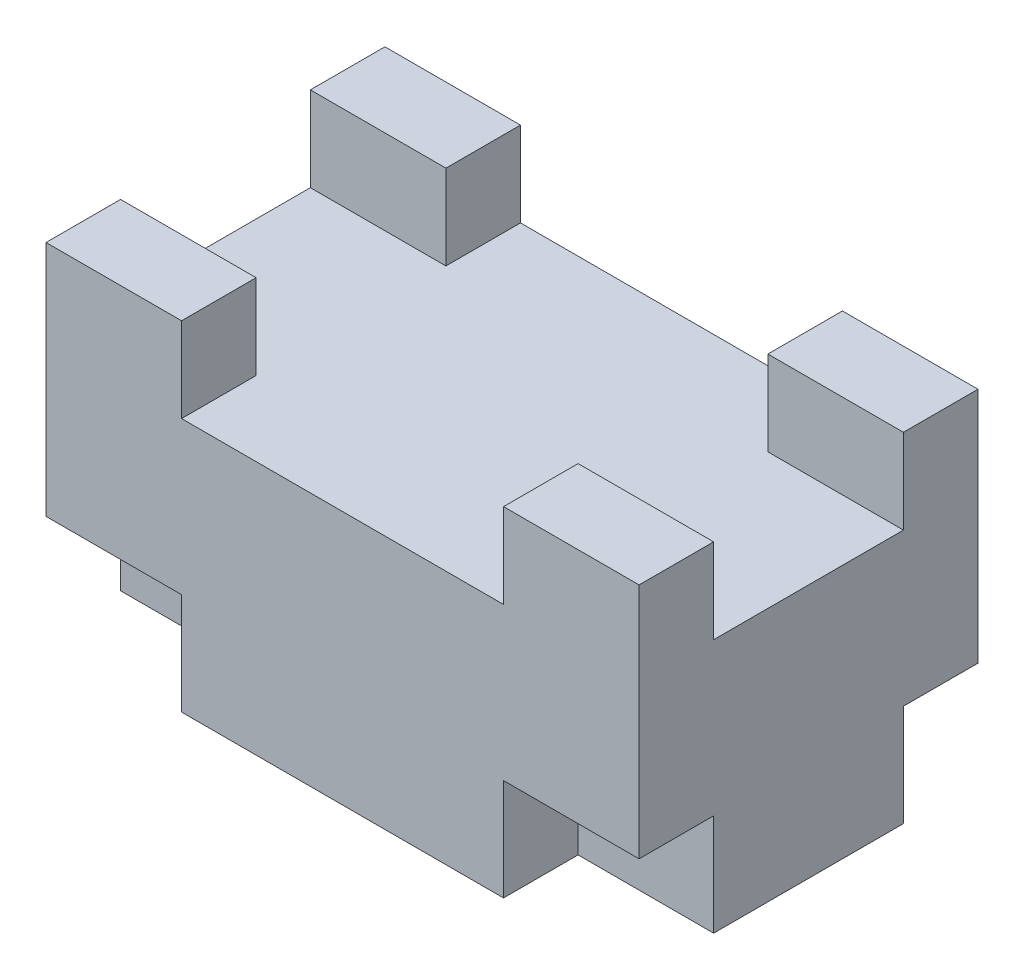
ISO-10303-21;
HEADER;
FILE_DESCRIPTION(('STEP AP214'),'2;1');
FILE_NAME('part.step','',(''),(''),'','','');
FILE_SCHEMA(('AUTOMOTIVE_DESIGN { 1 0 10303 214 1 1 1 1 }'));
ENDSEC;
DATA;
#1=APPLICATION_CONTEXT('core data for automotive mechanical design processes');
#2=APPLICATION_PROTOCOL_DEFINITION('international standard','automotive_design',2000,#1);
#3=PRODUCT_CONTEXT('',#1,'mechanical');
#4=PRODUCT('Part','Part','',(#3));
#5=PRODUCT_RELATED_PRODUCT_CATEGORY('part','',(#4));
#6=PRODUCT_DEFINITION_FORMATION('','',#4);
#7=PRODUCT_DEFINITION_CONTEXT('part definition',#1,'design');
#8=PRODUCT_DEFINITION('design','',#6,#7);
#9=PRODUCT_DEFINITION_SHAPE('','',#8);
#10=(LENGTH_UNIT() NAMED_UNIT(*) SI_UNIT(.MILLI.,.METRE.));
#11=(NAMED_UNIT(*) PLANE_ANGLE_UNIT() SI_UNIT($,.RADIAN.));
#12=(NAMED_UNIT(*) SI_UNIT($,.STERADIAN.) SOLID_ANGLE_UNIT());
#13=UNCERTAINTY_MEASURE_WITH_UNIT(LENGTH_MEASURE(1.E-05),#10,'distance_accuracy_value','');
#14=(GEOMETRIC_REPRESENTATION_CONTEXT(3) GLOBAL_UNCERTAINTY_ASSIGNED_CONTEXT((#13)) GLOBAL_UNIT_ASSIGNED_CONTEXT((#10,
#11,#12)) REPRESENTATION_CONTEXT('',''));
#15=CARTESIAN_POINT('',(0.,0.,0.));
#16=DIRECTION('',(0.,0.,1.));
#17=DIRECTION('',(1.,0.,0.));
#18=AXIS2_PLACEMENT_3D('',#15,#16,#17);
#19=CARTESIAN_POINT('',(87.5,75.,-50.));
#20=DIRECTION('',(-1.,0.,0.));
#21=DIRECTION('',(0.,0.,1.));
#22=AXIS2_PLACEMENT_3D('',#19,#20,#21);
#23=PLANE('',#22);
#24=DIRECTION('',(0.,0.,1.));
#25=VECTOR('',#24,1.);
#26=CARTESIAN_POINT('',(87.5,30.,50.));
#27=LINE('',#26,#25);
#28=CARTESIAN_POINT('',(87.5,30.,28.));
#29=VERTEX_POINT('',#28);
#30=CARTESIAN_POINT('',(87.5,30.,50.));
#31=VERTEX_POINT('',#30);
#32=EDGE_CURVE('E363',#29,#31,#27,.T.);
#33=ORIENTED_EDGE('',*,*,#32,.F.);
#34=DIRECTION('',(0.,-1.,0.));
#35=VECTOR('',#34,1.);
#36=CARTESIAN_POINT('',(87.5,30.,28.));
#37=LINE('',#36,#35);
#38=CARTESIAN_POINT('',(87.5,0.,28.));
#39=VERTEX_POINT('',#38);
#40=EDGE_CURVE('E356',#29,#39,#37,.T.);
#41=ORIENTED_EDGE('',*,*,#40,.T.);
#42=DIRECTION('',(0.,0.,-1.));
#43=VECTOR('',#42,1.);
#44=CARTESIAN_POINT('',(87.5,0.,-50.));
#45=LINE('',#44,#43);
#46=CARTESIAN_POINT('',(87.5,0.,-28.));
#47=VERTEX_POINT('',#46);
#48=EDGE_CURVE('E416',#39,#47,#45,.T.);
#49=ORIENTED_EDGE('',*,*,#48,.T.);
#50=DIRECTION('',(0.,-1.,0.));
#51=VECTOR('',#50,1.);
#52=CARTESIAN_POINT('',(87.5,30.,-28.));
#53=LINE('',#52,#51);
#54=CARTESIAN_POINT('',(87.5,30.,-28.));
#55=VERTEX_POINT('',#54);
#56=EDGE_CURVE('E328',#55,#47,#53,.T.);
#57=ORIENTED_EDGE('',*,*,#56,.F.);
#58=DIRECTION('',(0.,0.,1.));
#59=VECTOR('',#58,1.);
#60=CARTESIAN_POINT('',(87.5,30.,-50.));
#61=LINE('',#60,#59);
#62=CARTESIAN_POINT('',(87.5,30.,-50.));
#63=VERTEX_POINT('',#62);
#64=EDGE_CURVE('E338',#63,#55,#61,.T.);
#65=ORIENTED_EDGE('',*,*,#64,.F.);
#66=DIRECTION('',(0.,-1.,0.));
#67=VECTOR('',#66,1.);
#68=CARTESIAN_POINT('',(87.5,75.,-50.));
#69=LINE('',#68,#67);
#70=CARTESIAN_POINT('',(87.5,100.,-50.));
#71=VERTEX_POINT('',#70);
#72=EDGE_CURVE('E11',#71,#63,#69,.T.);
#73=ORIENTED_EDGE('',*,*,#72,.F.);
#74=DIRECTION('',(0.,0.,-1.));
#75=VECTOR('',#74,1.);
#76=CARTESIAN_POINT('',(87.5,100.,-50.));
#77=LINE('',#76,#75);
#78=CARTESIAN_POINT('',(87.5,100.,-28.));
#79=VERTEX_POINT('',#78);
#80=EDGE_CURVE('E230',#79,#71,#77,.T.);
#81=ORIENTED_EDGE('',*,*,#80,.F.);
#82=DIRECTION('',(0.,-1.,0.));
#83=VECTOR('',#82,1.);
#84=CARTESIAN_POINT('',(87.5,100.,-28.));
#85=LINE('',#84,#83);
#86=CARTESIAN_POINT('',(87.5,75.,-28.));
#87=VERTEX_POINT('',#86);
#88=EDGE_CURVE('E245',#79,#87,#85,.T.);
#89=ORIENTED_EDGE('',*,*,#88,.T.);
#90=DIRECTION('',(0.,0.,-1.));
#91=VECTOR('',#90,1.);
#92=CARTESIAN_POINT('',(87.5,75.,-50.));
#93=LINE('',#92,#91);
#94=CARTESIAN_POINT('',(87.5,75.,28.));
#95=VERTEX_POINT('',#94);
#96=EDGE_CURVE('E225',#95,#87,#93,.T.);
#97=ORIENTED_EDGE('',*,*,#96,.F.);
#98=DIRECTION('',(0.,-1.,0.));
#99=VECTOR('',#98,1.);
#100=CARTESIAN_POINT('',(87.5,100.,28.));
#101=LINE('',#100,#99);
#102=CARTESIAN_POINT('',(87.5,100.,28.));
#103=VERTEX_POINT('',#102);
#104=EDGE_CURVE('E258',#103,#95,#101,.T.);
#105=ORIENTED_EDGE('',*,*,#104,.F.);
#106=DIRECTION('',(0.,0.,-1.));
#107=VECTOR('',#106,1.);
#108=CARTESIAN_POINT('',(87.5,100.,50.));
#109=LINE('',#108,#107);
#110=CARTESIAN_POINT('',(87.5,100.,50.));
#111=VERTEX_POINT('',#110);
#112=EDGE_CURVE('E270',#111,#103,#109,.T.);
#113=ORIENTED_EDGE('',*,*,#112,.F.);
#114=DIRECTION('',(0.,-1.,0.));
#115=VECTOR('',#114,1.);
#116=CARTESIAN_POINT('',(87.5,75.,50.));
#117=LINE('',#116,#115);
#118=EDGE_CURVE('E427',#111,#31,#117,.T.);
#119=ORIENTED_EDGE('',*,*,#118,.T.);
#120=EDGE_LOOP('',(#33,#41,#49,#57,#65,#73,#81,#89,#97,#105,#113,#119));
#121=FACE_BOUND('',#120,.T.);
#122=ADVANCED_FACE('F39',(#121),#23,.F.);
#123=CARTESIAN_POINT('',(-87.5,75.,-50.));
#124=DIRECTION('',(0.,0.,1.));
#125=DIRECTION('',(1.,0.,0.));
#126=AXIS2_PLACEMENT_3D('',#123,#124,#125);
#127=PLANE('',#126);
#128=DIRECTION('',(-1.,0.,0.));
#129=VECTOR('',#128,1.);
#130=CARTESIAN_POINT('',(-87.5,0.,-50.));
#131=LINE('',#130,#129);
#132=CARTESIAN_POINT('',(47.5,0.,-50.));
#133=VERTEX_POINT('',#132);
#134=CARTESIAN_POINT('',(-47.5,0.,-50.));
#135=VERTEX_POINT('',#134);
#136=EDGE_CURVE('E430',#133,#135,#131,.T.);
#137=ORIENTED_EDGE('',*,*,#136,.T.);
#138=DIRECTION('',(0.,-1.,0.));
#139=VECTOR('',#138,1.);
#140=CARTESIAN_POINT('',(-47.5,30.,-50.));
#141=LINE('',#140,#139);
#142=CARTESIAN_POINT('',(-47.5,30.,-50.));
#143=VERTEX_POINT('',#142);
#144=EDGE_CURVE('E376',#143,#135,#141,.T.);
#145=ORIENTED_EDGE('',*,*,#144,.F.);
#146=DIRECTION('',(1.,0.,0.));
#147=VECTOR('',#146,1.);
#148=CARTESIAN_POINT('',(-87.5,30.,-50.));
#149=LINE('',#148,#147);
#150=CARTESIAN_POINT('',(-87.5,30.,-50.));
#151=VERTEX_POINT('',#150);
#152=EDGE_CURVE('E393',#151,#143,#149,.T.);
#153=ORIENTED_EDGE('',*,*,#152,.F.);
#154=DIRECTION('',(0.,-1.,0.));
#155=VECTOR('',#154,1.);
#156=CARTESIAN_POINT('',(-87.5,75.,-50.));
#157=LINE('',#156,#155);
#158=CARTESIAN_POINT('',(-87.5,100.,-50.));
#159=VERTEX_POINT('',#158);
#160=EDGE_CURVE('E46',#159,#151,#157,.T.);
#161=ORIENTED_EDGE('',*,*,#160,.F.);
#162=DIRECTION('',(-1.,0.,0.));
#163=VECTOR('',#162,1.);
#164=CARTESIAN_POINT('',(-87.5,100.,-50.));
#165=LINE('',#164,#163);
#166=CARTESIAN_POINT('',(-47.5,100.,-50.));
#167=VERTEX_POINT('',#166);
#168=EDGE_CURVE('E311',#167,#159,#165,.T.);
#169=ORIENTED_EDGE('',*,*,#168,.F.);
#170=DIRECTION('',(0.,-1.,0.));
#171=VECTOR('',#170,1.);
#172=CARTESIAN_POINT('',(-47.5,100.,-50.));
#173=LINE('',#172,#171);
#174=CARTESIAN_POINT('',(-47.5,75.,-50.));
#175=VERTEX_POINT('',#174);
#176=EDGE_CURVE('E314',#167,#175,#173,.T.);
#177=ORIENTED_EDGE('',*,*,#176,.T.);
#178=DIRECTION('',(-1.,0.,0.));
#179=VECTOR('',#178,1.);
#180=CARTESIAN_POINT('',(-87.5,75.,-50.));
#181=LINE('',#180,#179);
#182=CARTESIAN_POINT('',(47.5,75.,-50.));
#183=VERTEX_POINT('',#182);
#184=EDGE_CURVE('E421',#183,#175,#181,.T.);
#185=ORIENTED_EDGE('',*,*,#184,.F.);
#186=DIRECTION('',(0.,-1.,0.));
#187=VECTOR('',#186,1.);
#188=CARTESIAN_POINT('',(47.5,100.,-50.));
#189=LINE('',#188,#187);
#190=CARTESIAN_POINT('',(47.5,100.,-50.));
#191=VERTEX_POINT('',#190);
#192=EDGE_CURVE('E240',#191,#183,#189,.T.);
#193=ORIENTED_EDGE('',*,*,#192,.F.);
#194=DIRECTION('',(-1.,0.,0.));
#195=VECTOR('',#194,1.);
#196=CARTESIAN_POINT('',(87.5,100.,-50.));
#197=LINE('',#196,#195);
#198=EDGE_CURVE('E254',#71,#191,#197,.T.);
#199=ORIENTED_EDGE('',*,*,#198,.F.);
#200=ORIENTED_EDGE('',*,*,#72,.T.);
#201=DIRECTION('',(1.,0.,0.));
#202=VECTOR('',#201,1.);
#203=CARTESIAN_POINT('',(87.5,30.,-50.));
#204=LINE('',#203,#202);
#205=CARTESIAN_POINT('',(47.5,30.,-50.));
#206=VERTEX_POINT('',#205);
#207=EDGE_CURVE('E330',#206,#63,#204,.T.);
#208=ORIENTED_EDGE('',*,*,#207,.F.);
#209=DIRECTION('',(0.,-1.,0.));
#210=VECTOR('',#209,1.);
#211=CARTESIAN_POINT('',(47.5,30.,-50.));
#212=LINE('',#211,#210);
#213=EDGE_CURVE('E327',#206,#133,#212,.T.);
#214=ORIENTED_EDGE('',*,*,#213,.T.);
#215=EDGE_LOOP('',(#137,#145,#153,#161,#169,#177,#185,#193,#199,#200,#208,#214));
#216=FACE_BOUND('',#215,.T.);
#217=ADVANCED_FACE('F451',(#216),#127,.F.);
#218=CARTESIAN_POINT('',(-87.5,75.,-50.));
#219=DIRECTION('',(1.,0.,0.));
#220=DIRECTION('',(0.,0.,-1.));
#221=AXIS2_PLACEMENT_3D('',#218,#219,#220);
#222=PLANE('',#221);
#223=DIRECTION('',(0.,0.,-1.));
#224=VECTOR('',#223,1.);
#225=CARTESIAN_POINT('',(-87.5,30.,-50.));
#226=LINE('',#225,#224);
#227=CARTESIAN_POINT('',(-87.5,30.,-28.));
#228=VERTEX_POINT('',#227);
#229=EDGE_CURVE('E385',#228,#151,#226,.T.);
#230=ORIENTED_EDGE('',*,*,#229,.F.);
#231=DIRECTION('',(0.,-1.,0.));
#232=VECTOR('',#231,1.);
#233=CARTESIAN_POINT('',(-87.5,30.,-28.));
#234=LINE('',#233,#232);
#235=CARTESIAN_POINT('',(-87.5,0.,-28.));
#236=VERTEX_POINT('',#235);
#237=EDGE_CURVE('E341',#228,#236,#234,.T.);
#238=ORIENTED_EDGE('',*,*,#237,.T.);
#239=DIRECTION('',(0.,0.,1.));
#240=VECTOR('',#239,1.);
#241=CARTESIAN_POINT('',(-87.5,0.,-50.));
#242=LINE('',#241,#240);
#243=CARTESIAN_POINT('',(-87.5,0.,28.));
#244=VERTEX_POINT('',#243);
#245=EDGE_CURVE('E433',#236,#244,#242,.T.);
#246=ORIENTED_EDGE('',*,*,#245,.T.);
#247=DIRECTION('',(0.,-1.,0.));
#248=VECTOR('',#247,1.);
#249=CARTESIAN_POINT('',(-87.5,30.,28.));
#250=LINE('',#249,#248);
#251=CARTESIAN_POINT('',(-87.5,30.,28.));
#252=VERTEX_POINT('',#251);
#253=EDGE_CURVE('E409',#252,#244,#250,.T.);
#254=ORIENTED_EDGE('',*,*,#253,.F.);
#255=DIRECTION('',(0.,0.,-1.));
#256=VECTOR('',#255,1.);
#257=CARTESIAN_POINT('',(-87.5,30.,50.));
#258=LINE('',#257,#256);
#259=CARTESIAN_POINT('',(-87.5,30.,50.));
#260=VERTEX_POINT('',#259);
#261=EDGE_CURVE('E397',#260,#252,#258,.T.);
#262=ORIENTED_EDGE('',*,*,#261,.F.);
#263=DIRECTION('',(0.,-1.,0.));
#264=VECTOR('',#263,1.);
#265=CARTESIAN_POINT('',(-87.5,75.,50.));
#266=LINE('',#265,#264);
#267=CARTESIAN_POINT('',(-87.5,100.,50.));
#268=VERTEX_POINT('',#267);
#269=EDGE_CURVE('E440',#268,#260,#266,.T.);
#270=ORIENTED_EDGE('',*,*,#269,.F.);
#271=DIRECTION('',(0.,0.,1.));
#272=VECTOR('',#271,1.);
#273=CARTESIAN_POINT('',(-87.5,100.,50.));
#274=LINE('',#273,#272);
#275=CARTESIAN_POINT('',(-87.5,100.,28.));
#276=VERTEX_POINT('',#275);
#277=EDGE_CURVE('E294',#276,#268,#274,.T.);
#278=ORIENTED_EDGE('',*,*,#277,.F.);
#279=DIRECTION('',(0.,-1.,0.));
#280=VECTOR('',#279,1.);
#281=CARTESIAN_POINT('',(-87.5,100.,28.));
#282=LINE('',#281,#280);
#283=CARTESIAN_POINT('',(-87.5,75.,28.));
#284=VERTEX_POINT('',#283);
#285=EDGE_CURVE('E287',#276,#284,#282,.T.);
#286=ORIENTED_EDGE('',*,*,#285,.T.);
#287=DIRECTION('',(0.,0.,1.));
#288=VECTOR('',#287,1.);
#289=CARTESIAN_POINT('',(-87.5,75.,-50.));
#290=LINE('',#289,#288);
#291=CARTESIAN_POINT('',(-87.5,75.,-28.));
#292=VERTEX_POINT('',#291);
#293=EDGE_CURVE('E424',#292,#284,#290,.T.);
#294=ORIENTED_EDGE('',*,*,#293,.F.);
#295=DIRECTION('',(0.,-1.,0.));
#296=VECTOR('',#295,1.);
#297=CARTESIAN_POINT('',(-87.5,100.,-28.));
#298=LINE('',#297,#296);
#299=CARTESIAN_POINT('',(-87.5,100.,-28.));
#300=VERTEX_POINT('',#299);
#301=EDGE_CURVE('E324',#300,#292,#298,.T.);
#302=ORIENTED_EDGE('',*,*,#301,.F.);
#303=DIRECTION('',(0.,0.,1.));
#304=VECTOR('',#303,1.);
#305=CARTESIAN_POINT('',(-87.5,100.,-50.));
#306=LINE('',#305,#304);
#307=EDGE_CURVE('E303',#159,#300,#306,.T.);
#308=ORIENTED_EDGE('',*,*,#307,.F.);
#309=ORIENTED_EDGE('',*,*,#160,.T.);
#310=EDGE_LOOP('',(#230,#238,#246,#254,#262,#270,#278,#286,#294,#302,#308,#309));
#311=FACE_BOUND('',#310,.T.);
#312=ADVANCED_FACE('F446',(#311),#222,.F.);
#313=CARTESIAN_POINT('',(-87.5,75.,50.));
#314=DIRECTION('',(0.,0.,-1.));
#315=DIRECTION('',(-1.,0.,0.));
#316=AXIS2_PLACEMENT_3D('',#313,#314,#315);
#317=PLANE('',#316);
#318=DIRECTION('',(1.,0.,0.));
#319=VECTOR('',#318,1.);
#320=CARTESIAN_POINT('',(-87.5,0.,50.));
#321=LINE('',#320,#319);
#322=CARTESIAN_POINT('',(-47.4999999999999,0.,50.));
#323=VERTEX_POINT('',#322);
#324=CARTESIAN_POINT('',(47.5,0.,50.));
#325=VERTEX_POINT('',#324);
#326=EDGE_CURVE('E422',#323,#325,#321,.T.);
#327=ORIENTED_EDGE('',*,*,#326,.T.);
#328=DIRECTION('',(0.,-1.,0.));
#329=VECTOR('',#328,1.);
#330=CARTESIAN_POINT('',(47.5,30.,50.));
#331=LINE('',#330,#329);
#332=CARTESIAN_POINT('',(47.5,30.,50.));
#333=VERTEX_POINT('',#332);
#334=EDGE_CURVE('E351',#333,#325,#331,.T.);
#335=ORIENTED_EDGE('',*,*,#334,.F.);
#336=DIRECTION('',(-1.,0.,0.));
#337=VECTOR('',#336,1.);
#338=CARTESIAN_POINT('',(87.5,30.,50.));
#339=LINE('',#338,#337);
#340=EDGE_CURVE('E372',#31,#333,#339,.T.);
#341=ORIENTED_EDGE('',*,*,#340,.F.);
#342=ORIENTED_EDGE('',*,*,#118,.F.);
#343=DIRECTION('',(1.,0.,0.));
#344=VECTOR('',#343,1.);
#345=CARTESIAN_POINT('',(87.5,100.,50.));
#346=LINE('',#345,#344);
#347=CARTESIAN_POINT('',(47.5,100.,50.));
#348=VERTEX_POINT('',#347);
#349=EDGE_CURVE('E267',#348,#111,#346,.T.);
#350=ORIENTED_EDGE('',*,*,#349,.F.);
#351=DIRECTION('',(0.,-1.,0.));
#352=VECTOR('',#351,1.);
#353=CARTESIAN_POINT('',(47.5,100.,50.));
#354=LINE('',#353,#352);
#355=CARTESIAN_POINT('',(47.5,75.,50.));
#356=VERTEX_POINT('',#355);
#357=EDGE_CURVE('E264',#348,#356,#354,.T.);
#358=ORIENTED_EDGE('',*,*,#357,.T.);
#359=DIRECTION('',(1.,0.,0.));
#360=VECTOR('',#359,1.);
#361=CARTESIAN_POINT('',(-87.5,75.,50.));
#362=LINE('',#361,#360);
#363=CARTESIAN_POINT('',(-47.5,75.,50.));
#364=VERTEX_POINT('',#363);
#365=EDGE_CURVE('E53',#364,#356,#362,.T.);
#366=ORIENTED_EDGE('',*,*,#365,.F.);
#367=DIRECTION('',(0.,-1.,0.));
#368=VECTOR('',#367,1.);
#369=CARTESIAN_POINT('',(-47.5,100.,50.));
#370=LINE('',#369,#368);
#371=CARTESIAN_POINT('',(-47.5,100.,50.));
#372=VERTEX_POINT('',#371);
#373=EDGE_CURVE('E281',#372,#364,#370,.T.);
#374=ORIENTED_EDGE('',*,*,#373,.F.);
#375=DIRECTION('',(1.,0.,0.));
#376=VECTOR('',#375,1.);
#377=CARTESIAN_POINT('',(-87.5,100.,50.));
#378=LINE('',#377,#376);
#379=EDGE_CURVE('E299',#268,#372,#378,.T.);
#380=ORIENTED_EDGE('',*,*,#379,.F.);
#381=ORIENTED_EDGE('',*,*,#269,.T.);
#382=DIRECTION('',(-1.,0.,0.));
#383=VECTOR('',#382,1.);
#384=CARTESIAN_POINT('',(-87.5,30.,50.));
#385=LINE('',#384,#383);
#386=CARTESIAN_POINT('',(-47.4999999999999,30.,50.));
#387=VERTEX_POINT('',#386);
#388=EDGE_CURVE('E407',#387,#260,#385,.T.);
#389=ORIENTED_EDGE('',*,*,#388,.F.);
#390=DIRECTION('',(0.,-1.,0.));
#391=VECTOR('',#390,1.);
#392=CARTESIAN_POINT('',(-47.4999999999999,30.,50.));
#393=LINE('',#392,#391);
#394=EDGE_CURVE('E413',#387,#323,#393,.T.);
#395=ORIENTED_EDGE('',*,*,#394,.T.);
#396=EDGE_LOOP('',(#327,#335,#341,#342,#350,#358,#366,#374,#380,#381,#389,#395));
#397=FACE_BOUND('',#396,.T.);
#398=ADVANCED_FACE('F476',(#397),#317,.F.);
#399=CARTESIAN_POINT('',(0.,75.,0.));
#400=DIRECTION('',(0.,1.,0.));
#401=DIRECTION('',(0.,0.,1.));
#402=AXIS2_PLACEMENT_3D('',#399,#400,#401);
#403=PLANE('',#402);
#404=DIRECTION('',(-1.,0.,0.));
#405=VECTOR('',#404,1.);
#406=CARTESIAN_POINT('',(-87.5,75.,28.));
#407=LINE('',#406,#405);
#408=CARTESIAN_POINT('',(-47.5,75.,28.));
#409=VERTEX_POINT('',#408);
#410=EDGE_CURVE('E291',#409,#284,#407,.T.);
#411=ORIENTED_EDGE('',*,*,#410,.F.);
#412=DIRECTION('',(0.,0.,-1.));
#413=VECTOR('',#412,1.);
#414=CARTESIAN_POINT('',(-47.5,75.,50.));
#415=LINE('',#414,#413);
#416=EDGE_CURVE('E58',#364,#409,#415,.T.);
#417=ORIENTED_EDGE('',*,*,#416,.F.);
#418=ORIENTED_EDGE('',*,*,#365,.T.);
#419=DIRECTION('',(0.,0.,1.));
#420=VECTOR('',#419,1.);
#421=CARTESIAN_POINT('',(47.5,75.,50.));
#422=LINE('',#421,#420);
#423=CARTESIAN_POINT('',(47.5,75.,28.));
#424=VERTEX_POINT('',#423);
#425=EDGE_CURVE('E268',#424,#356,#422,.T.);
#426=ORIENTED_EDGE('',*,*,#425,.F.);
#427=DIRECTION('',(-1.,0.,0.));
#428=VECTOR('',#427,1.);
#429=CARTESIAN_POINT('',(87.5,75.,28.));
#430=LINE('',#429,#428);
#431=EDGE_CURVE('E248',#95,#424,#430,.T.);
#432=ORIENTED_EDGE('',*,*,#431,.F.);
#433=ORIENTED_EDGE('',*,*,#96,.T.);
#434=DIRECTION('',(1.,0.,0.));
#435=VECTOR('',#434,1.);
#436=CARTESIAN_POINT('',(87.5,75.,-28.));
#437=LINE('',#436,#435);
#438=CARTESIAN_POINT('',(47.5,75.,-28.));
#439=VERTEX_POINT('',#438);
#440=EDGE_CURVE('E219',#439,#87,#437,.T.);
#441=ORIENTED_EDGE('',*,*,#440,.F.);
#442=DIRECTION('',(0.,0.,1.));
#443=VECTOR('',#442,1.);
#444=CARTESIAN_POINT('',(47.5,75.,-50.));
#445=LINE('',#444,#443);
#446=EDGE_CURVE('E222',#183,#439,#445,.T.);
#447=ORIENTED_EDGE('',*,*,#446,.F.);
#448=ORIENTED_EDGE('',*,*,#184,.T.);
#449=DIRECTION('',(0.,0.,-1.));
#450=VECTOR('',#449,1.);
#451=CARTESIAN_POINT('',(-47.5,75.,-50.));
#452=LINE('',#451,#450);
#453=CARTESIAN_POINT('',(-47.5,75.,-28.));
#454=VERTEX_POINT('',#453);
#455=EDGE_CURVE('E307',#454,#175,#452,.T.);
#456=ORIENTED_EDGE('',*,*,#455,.F.);
#457=DIRECTION('',(1.,0.,0.));
#458=VECTOR('',#457,1.);
#459=CARTESIAN_POINT('',(-87.5,75.,-28.));
#460=LINE('',#459,#458);
#461=EDGE_CURVE('E241',#292,#454,#460,.T.);
#462=ORIENTED_EDGE('',*,*,#461,.F.);
#463=ORIENTED_EDGE('',*,*,#293,.T.);
#464=EDGE_LOOP('',(#411,#417,#418,#426,#432,#433,#441,#447,#448,#456,#462,#463));
#465=FACE_BOUND('',#464,.T.);
#466=ADVANCED_FACE('F221',(#465),#403,.T.);
#467=CARTESIAN_POINT('',(0.,0.,0.));
#468=DIRECTION('',(0.,1.,0.));
#469=DIRECTION('',(0.,0.,1.));
#470=AXIS2_PLACEMENT_3D('',#467,#468,#469);
#471=PLANE('',#470);
#472=ORIENTED_EDGE('',*,*,#48,.F.);
#473=DIRECTION('',(1.,0.,0.));
#474=VECTOR('',#473,1.);
#475=CARTESIAN_POINT('',(87.5,0.,28.));
#476=LINE('',#475,#474);
#477=CARTESIAN_POINT('',(47.5,0.,28.));
#478=VERTEX_POINT('',#477);
#479=EDGE_CURVE('E360',#478,#39,#476,.T.);
#480=ORIENTED_EDGE('',*,*,#479,.F.);
#481=DIRECTION('',(0.,0.,-1.));
#482=VECTOR('',#481,1.);
#483=CARTESIAN_POINT('',(47.5,0.,50.));
#484=LINE('',#483,#482);
#485=EDGE_CURVE('E362',#325,#478,#484,.T.);
#486=ORIENTED_EDGE('',*,*,#485,.F.);
#487=ORIENTED_EDGE('',*,*,#326,.F.);
#488=DIRECTION('',(0.,0.,1.));
#489=VECTOR('',#488,1.);
#490=CARTESIAN_POINT('',(-47.4999999999999,0.,50.));
#491=LINE('',#490,#489);
#492=CARTESIAN_POINT('',(-47.4999999999999,0.,28.));
#493=VERTEX_POINT('',#492);
#494=EDGE_CURVE('E401',#493,#323,#491,.T.);
#495=ORIENTED_EDGE('',*,*,#494,.F.);
#496=DIRECTION('',(1.,0.,0.));
#497=VECTOR('',#496,1.);
#498=CARTESIAN_POINT('',(-87.5,0.,28.));
#499=LINE('',#498,#497);
#500=EDGE_CURVE('E366',#244,#493,#499,.T.);
#501=ORIENTED_EDGE('',*,*,#500,.F.);
#502=ORIENTED_EDGE('',*,*,#245,.F.);
#503=DIRECTION('',(-1.,0.,0.));
#504=VECTOR('',#503,1.);
#505=CARTESIAN_POINT('',(-87.5,0.,-28.));
#506=LINE('',#505,#504);
#507=CARTESIAN_POINT('',(-47.5,0.,-28.));
#508=VERTEX_POINT('',#507);
#509=EDGE_CURVE('E383',#508,#236,#506,.T.);
#510=ORIENTED_EDGE('',*,*,#509,.F.);
#511=DIRECTION('',(0.,0.,1.));
#512=VECTOR('',#511,1.);
#513=CARTESIAN_POINT('',(-47.5,0.,-50.));
#514=LINE('',#513,#512);
#515=EDGE_CURVE('E359',#135,#508,#514,.T.);
#516=ORIENTED_EDGE('',*,*,#515,.F.);
#517=ORIENTED_EDGE('',*,*,#136,.F.);
#518=DIRECTION('',(0.,0.,-1.));
#519=VECTOR('',#518,1.);
#520=CARTESIAN_POINT('',(47.5,0.,-50.));
#521=LINE('',#520,#519);
#522=CARTESIAN_POINT('',(47.5,0.,-28.));
#523=VERTEX_POINT('',#522);
#524=EDGE_CURVE('E335',#523,#133,#521,.T.);
#525=ORIENTED_EDGE('',*,*,#524,.F.);
#526=DIRECTION('',(-1.,0.,0.));
#527=VECTOR('',#526,1.);
#528=CARTESIAN_POINT('',(87.5,0.,-28.));
#529=LINE('',#528,#527);
#530=EDGE_CURVE('E337',#47,#523,#529,.T.);
#531=ORIENTED_EDGE('',*,*,#530,.F.);
#532=EDGE_LOOP('',(#472,#480,#486,#487,#495,#501,#502,#510,#516,#517,#525,#531));
#533=FACE_BOUND('',#532,.T.);
#534=ADVANCED_FACE('F505',(#533),#471,.F.);
#535=CARTESIAN_POINT('',(-47.4999999999999,30.,50.));
#536=DIRECTION('',(1.,0.,0.));
#537=DIRECTION('',(0.,0.,-1.));
#538=AXIS2_PLACEMENT_3D('',#535,#536,#537);
#539=PLANE('',#538);
#540=ORIENTED_EDGE('',*,*,#494,.T.);
#541=ORIENTED_EDGE('',*,*,#394,.F.);
#542=DIRECTION('',(0.,0.,1.));
#543=VECTOR('',#542,1.);
#544=CARTESIAN_POINT('',(-47.4999999999999,30.,50.));
#545=LINE('',#544,#543);
#546=CARTESIAN_POINT('',(-47.4999999999999,30.,28.));
#547=VERTEX_POINT('',#546);
#548=EDGE_CURVE('E404',#547,#387,#545,.T.);
#549=ORIENTED_EDGE('',*,*,#548,.F.);
#550=DIRECTION('',(0.,-1.,0.));
#551=VECTOR('',#550,1.);
#552=CARTESIAN_POINT('',(-47.4999999999999,30.,28.));
#553=LINE('',#552,#551);
#554=EDGE_CURVE('E417',#547,#493,#553,.T.);
#555=ORIENTED_EDGE('',*,*,#554,.T.);
#556=EDGE_LOOP('',(#540,#541,#549,#555));
#557=FACE_BOUND('',#556,.T.);
#558=ADVANCED_FACE('F536',(#557),#539,.F.);
#559=CARTESIAN_POINT('',(-87.5,30.,28.));
#560=DIRECTION('',(0.,0.,-1.));
#561=DIRECTION('',(-1.,0.,0.));
#562=AXIS2_PLACEMENT_3D('',#559,#560,#561);
#563=PLANE('',#562);
#564=ORIENTED_EDGE('',*,*,#500,.T.);
#565=ORIENTED_EDGE('',*,*,#554,.F.);
#566=DIRECTION('',(1.,0.,0.));
#567=VECTOR('',#566,1.);
#568=CARTESIAN_POINT('',(-87.5,30.,28.));
#569=LINE('',#568,#567);
#570=EDGE_CURVE('E400',#252,#547,#569,.T.);
#571=ORIENTED_EDGE('',*,*,#570,.F.);
#572=ORIENTED_EDGE('',*,*,#253,.T.);
#573=EDGE_LOOP('',(#564,#565,#571,#572));
#574=FACE_BOUND('',#573,.T.);
#575=ADVANCED_FACE('F518',(#574),#563,.F.);
#576=CARTESIAN_POINT('',(0.,30.,0.));
#577=DIRECTION('',(0.,-1.,0.));
#578=DIRECTION('',(0.,0.,-1.));
#579=AXIS2_PLACEMENT_3D('',#576,#577,#578);
#580=PLANE('',#579);
#581=ORIENTED_EDGE('',*,*,#261,.T.);
#582=ORIENTED_EDGE('',*,*,#570,.T.);
#583=ORIENTED_EDGE('',*,*,#548,.T.);
#584=ORIENTED_EDGE('',*,*,#388,.T.);
#585=EDGE_LOOP('',(#581,#582,#583,#584));
#586=FACE_BOUND('',#585,.T.);
#587=ADVANCED_FACE('F511',(#586),#580,.T.);
#588=CARTESIAN_POINT('',(47.5,30.,-50.));
#589=DIRECTION('',(-1.,0.,0.));
#590=DIRECTION('',(0.,0.,1.));
#591=AXIS2_PLACEMENT_3D('',#588,#589,#590);
#592=PLANE('',#591);
#593=ORIENTED_EDGE('',*,*,#524,.T.);
#594=ORIENTED_EDGE('',*,*,#213,.F.);
#595=DIRECTION('',(0.,0.,-1.));
#596=VECTOR('',#595,1.);
#597=CARTESIAN_POINT('',(47.5,30.,-50.));
#598=LINE('',#597,#596);
#599=CARTESIAN_POINT('',(47.5,30.,-28.));
#600=VERTEX_POINT('',#599);
#601=EDGE_CURVE('E343',#600,#206,#598,.T.);
#602=ORIENTED_EDGE('',*,*,#601,.F.);
#603=DIRECTION('',(0.,-1.,0.));
#604=VECTOR('',#603,1.);
#605=CARTESIAN_POINT('',(47.5,30.,-28.));
#606=LINE('',#605,#604);
#607=EDGE_CURVE('E331',#600,#523,#606,.T.);
#608=ORIENTED_EDGE('',*,*,#607,.T.);
#609=EDGE_LOOP('',(#593,#594,#602,#608));
#610=FACE_BOUND('',#609,.T.);
#611=ADVANCED_FACE('F509',(#610),#592,.F.);
#612=CARTESIAN_POINT('',(87.5,30.,-28.));
#613=DIRECTION('',(0.,0.,1.));
#614=DIRECTION('',(1.,0.,0.));
#615=AXIS2_PLACEMENT_3D('',#612,#613,#614);
#616=PLANE('',#615);
#617=ORIENTED_EDGE('',*,*,#530,.T.);
#618=ORIENTED_EDGE('',*,*,#607,.F.);
#619=DIRECTION('',(-1.,0.,0.));
#620=VECTOR('',#619,1.);
#621=CARTESIAN_POINT('',(87.5,30.,-28.));
#622=LINE('',#621,#620);
#623=EDGE_CURVE('E346',#55,#600,#622,.T.);
#624=ORIENTED_EDGE('',*,*,#623,.F.);
#625=ORIENTED_EDGE('',*,*,#56,.T.);
#626=EDGE_LOOP('',(#617,#618,#624,#625));
#627=FACE_BOUND('',#626,.T.);
#628=ADVANCED_FACE('F502',(#627),#616,.F.);
#629=CARTESIAN_POINT('',(0.,30.,0.));
#630=DIRECTION('',(0.,-1.,0.));
#631=DIRECTION('',(0.,0.,-1.));
#632=AXIS2_PLACEMENT_3D('',#629,#630,#631);
#633=PLANE('',#632);
#634=ORIENTED_EDGE('',*,*,#64,.T.);
#635=ORIENTED_EDGE('',*,*,#623,.T.);
#636=ORIENTED_EDGE('',*,*,#601,.T.);
#637=ORIENTED_EDGE('',*,*,#207,.T.);
#638=EDGE_LOOP('',(#634,#635,#636,#637));
#639=FACE_BOUND('',#638,.T.);
#640=ADVANCED_FACE('F496',(#639),#633,.T.);
#641=CARTESIAN_POINT('',(-87.5,30.,-28.));
#642=DIRECTION('',(0.,0.,1.));
#643=DIRECTION('',(1.,0.,0.));
#644=AXIS2_PLACEMENT_3D('',#641,#642,#643);
#645=PLANE('',#644);
#646=ORIENTED_EDGE('',*,*,#509,.T.);
#647=ORIENTED_EDGE('',*,*,#237,.F.);
#648=DIRECTION('',(-1.,0.,0.));
#649=VECTOR('',#648,1.);
#650=CARTESIAN_POINT('',(-87.5,30.,-28.));
#651=LINE('',#650,#649);
#652=CARTESIAN_POINT('',(-47.5,30.,-28.));
#653=VERTEX_POINT('',#652);
#654=EDGE_CURVE('E378',#653,#228,#651,.T.);
#655=ORIENTED_EDGE('',*,*,#654,.F.);
#656=DIRECTION('',(0.,-1.,0.));
#657=VECTOR('',#656,1.);
#658=CARTESIAN_POINT('',(-47.5,30.,-28.));
#659=LINE('',#658,#657);
#660=EDGE_CURVE('E379',#653,#508,#659,.T.);
#661=ORIENTED_EDGE('',*,*,#660,.T.);
#662=EDGE_LOOP('',(#646,#647,#655,#661));
#663=FACE_BOUND('',#662,.T.);
#664=ADVANCED_FACE('F551',(#663),#645,.F.);
#665=CARTESIAN_POINT('',(-47.5,30.,-50.));
#666=DIRECTION('',(1.,0.,0.));
#667=DIRECTION('',(0.,0.,-1.));
#668=AXIS2_PLACEMENT_3D('',#665,#666,#667);
#669=PLANE('',#668);
#670=ORIENTED_EDGE('',*,*,#515,.T.);
#671=ORIENTED_EDGE('',*,*,#660,.F.);
#672=DIRECTION('',(0.,0.,1.));
#673=VECTOR('',#672,1.);
#674=CARTESIAN_POINT('',(-47.5,30.,-50.));
#675=LINE('',#674,#673);
#676=EDGE_CURVE('E390',#143,#653,#675,.T.);
#677=ORIENTED_EDGE('',*,*,#676,.F.);
#678=ORIENTED_EDGE('',*,*,#144,.T.);
#679=EDGE_LOOP('',(#670,#671,#677,#678));
#680=FACE_BOUND('',#679,.T.);
#681=ADVANCED_FACE('F549',(#680),#669,.F.);
#682=CARTESIAN_POINT('',(0.,30.,0.));
#683=DIRECTION('',(0.,1.,0.));
#684=DIRECTION('',(0.,0.,1.));
#685=AXIS2_PLACEMENT_3D('',#682,#683,#684);
#686=PLANE('',#685);
#687=ORIENTED_EDGE('',*,*,#229,.T.);
#688=ORIENTED_EDGE('',*,*,#152,.T.);
#689=ORIENTED_EDGE('',*,*,#676,.T.);
#690=ORIENTED_EDGE('',*,*,#654,.T.);
#691=EDGE_LOOP('',(#687,#688,#689,#690));
#692=FACE_BOUND('',#691,.T.);
#693=ADVANCED_FACE('F545',(#692),#686,.F.);
#694=CARTESIAN_POINT('',(87.5,30.,28.));
#695=DIRECTION('',(0.,0.,-1.));
#696=DIRECTION('',(-1.,0.,0.));
#697=AXIS2_PLACEMENT_3D('',#694,#695,#696);
#698=PLANE('',#697);
#699=ORIENTED_EDGE('',*,*,#479,.T.);
#700=ORIENTED_EDGE('',*,*,#40,.F.);
#701=DIRECTION('',(1.,0.,0.));
#702=VECTOR('',#701,1.);
#703=CARTESIAN_POINT('',(87.5,30.,28.));
#704=LINE('',#703,#702);
#705=CARTESIAN_POINT('',(47.5,30.,28.));
#706=VERTEX_POINT('',#705);
#707=EDGE_CURVE('E353',#706,#29,#704,.T.);
#708=ORIENTED_EDGE('',*,*,#707,.F.);
#709=DIRECTION('',(0.,-1.,0.));
#710=VECTOR('',#709,1.);
#711=CARTESIAN_POINT('',(47.5,30.,28.));
#712=LINE('',#711,#710);
#713=EDGE_CURVE('E354',#706,#478,#712,.T.);
#714=ORIENTED_EDGE('',*,*,#713,.T.);
#715=EDGE_LOOP('',(#699,#700,#708,#714));
#716=FACE_BOUND('',#715,.T.);
#717=ADVANCED_FACE('F548',(#716),#698,.F.);
#718=CARTESIAN_POINT('',(47.5,30.,50.));
#719=DIRECTION('',(-1.,0.,0.));
#720=DIRECTION('',(0.,0.,1.));
#721=AXIS2_PLACEMENT_3D('',#718,#719,#720);
#722=PLANE('',#721);
#723=ORIENTED_EDGE('',*,*,#485,.T.);
#724=ORIENTED_EDGE('',*,*,#713,.F.);
#725=DIRECTION('',(0.,0.,-1.));
#726=VECTOR('',#725,1.);
#727=CARTESIAN_POINT('',(47.5,30.,50.));
#728=LINE('',#727,#726);
#729=EDGE_CURVE('E369',#333,#706,#728,.T.);
#730=ORIENTED_EDGE('',*,*,#729,.F.);
#731=ORIENTED_EDGE('',*,*,#334,.T.);
#732=EDGE_LOOP('',(#723,#724,#730,#731));
#733=FACE_BOUND('',#732,.T.);
#734=ADVANCED_FACE('F560',(#733),#722,.F.);
#735=CARTESIAN_POINT('',(0.,30.,0.));
#736=DIRECTION('',(0.,1.,0.));
#737=DIRECTION('',(0.,0.,1.));
#738=AXIS2_PLACEMENT_3D('',#735,#736,#737);
#739=PLANE('',#738);
#740=ORIENTED_EDGE('',*,*,#32,.T.);
#741=ORIENTED_EDGE('',*,*,#340,.T.);
#742=ORIENTED_EDGE('',*,*,#729,.T.);
#743=ORIENTED_EDGE('',*,*,#707,.T.);
#744=EDGE_LOOP('',(#740,#741,#742,#743));
#745=FACE_BOUND('',#744,.T.);
#746=ADVANCED_FACE('F558',(#745),#739,.F.);
#747=CARTESIAN_POINT('',(-87.5,100.,-28.));
#748=DIRECTION('',(0.,0.,-1.));
#749=DIRECTION('',(-1.,0.,0.));
#750=AXIS2_PLACEMENT_3D('',#747,#748,#749);
#751=PLANE('',#750);
#752=ORIENTED_EDGE('',*,*,#461,.T.);
#753=DIRECTION('',(0.,-1.,0.));
#754=VECTOR('',#753,1.);
#755=CARTESIAN_POINT('',(-47.5,100.,-28.));
#756=LINE('',#755,#754);
#757=CARTESIAN_POINT('',(-47.5,100.,-28.));
#758=VERTEX_POINT('',#757);
#759=EDGE_CURVE('E321',#758,#454,#756,.T.);
#760=ORIENTED_EDGE('',*,*,#759,.F.);
#761=DIRECTION('',(1.,0.,0.));
#762=VECTOR('',#761,1.);
#763=CARTESIAN_POINT('',(-87.5,100.,-28.));
#764=LINE('',#763,#762);
#765=EDGE_CURVE('E306',#300,#758,#764,.T.);
#766=ORIENTED_EDGE('',*,*,#765,.F.);
#767=ORIENTED_EDGE('',*,*,#301,.T.);
#768=EDGE_LOOP('',(#752,#760,#766,#767));
#769=FACE_BOUND('',#768,.T.);
#770=ADVANCED_FACE('F463',(#769),#751,.F.);
#771=CARTESIAN_POINT('',(-47.5,100.,-50.));
#772=DIRECTION('',(-1.,0.,0.));
#773=DIRECTION('',(0.,0.,1.));
#774=AXIS2_PLACEMENT_3D('',#771,#772,#773);
#775=PLANE('',#774);
#776=ORIENTED_EDGE('',*,*,#455,.T.);
#777=ORIENTED_EDGE('',*,*,#176,.F.);
#778=DIRECTION('',(0.,0.,-1.));
#779=VECTOR('',#778,1.);
#780=CARTESIAN_POINT('',(-47.5,100.,-50.));
#781=LINE('',#780,#779);
#782=EDGE_CURVE('E309',#758,#167,#781,.T.);
#783=ORIENTED_EDGE('',*,*,#782,.F.);
#784=ORIENTED_EDGE('',*,*,#759,.T.);
#785=EDGE_LOOP('',(#776,#777,#783,#784));
#786=FACE_BOUND('',#785,.T.);
#787=ADVANCED_FACE('F459',(#786),#775,.F.);
#788=CARTESIAN_POINT('',(0.,100.,0.));
#789=DIRECTION('',(0.,1.,0.));
#790=DIRECTION('',(0.,0.,1.));
#791=AXIS2_PLACEMENT_3D('',#788,#789,#790);
#792=PLANE('',#791);
#793=ORIENTED_EDGE('',*,*,#307,.T.);
#794=ORIENTED_EDGE('',*,*,#765,.T.);
#795=ORIENTED_EDGE('',*,*,#782,.T.);
#796=ORIENTED_EDGE('',*,*,#168,.T.);
#797=EDGE_LOOP('',(#793,#794,#795,#796));
#798=FACE_BOUND('',#797,.T.);
#799=ADVANCED_FACE('F454',(#798),#792,.T.);
#800=CARTESIAN_POINT('',(47.5,100.,-50.));
#801=DIRECTION('',(1.,0.,0.));
#802=DIRECTION('',(0.,0.,-1.));
#803=AXIS2_PLACEMENT_3D('',#800,#801,#802);
#804=PLANE('',#803);
#805=ORIENTED_EDGE('',*,*,#446,.T.);
#806=DIRECTION('',(0.,-1.,0.));
#807=VECTOR('',#806,1.);
#808=CARTESIAN_POINT('',(47.5,100.,-28.));
#809=LINE('',#808,#807);
#810=CARTESIAN_POINT('',(47.5,100.,-28.));
#811=VERTEX_POINT('',#810);
#812=EDGE_CURVE('E237',#811,#439,#809,.T.);
#813=ORIENTED_EDGE('',*,*,#812,.F.);
#814=DIRECTION('',(0.,0.,1.));
#815=VECTOR('',#814,1.);
#816=CARTESIAN_POINT('',(47.5,100.,-50.));
#817=LINE('',#816,#815);
#818=EDGE_CURVE('E252',#191,#811,#817,.T.);
#819=ORIENTED_EDGE('',*,*,#818,.F.);
#820=ORIENTED_EDGE('',*,*,#192,.T.);
#821=EDGE_LOOP('',(#805,#813,#819,#820));
#822=FACE_BOUND('',#821,.T.);
#823=ADVANCED_FACE('F235',(#822),#804,.F.);
#824=CARTESIAN_POINT('',(87.5,100.,-28.));
#825=DIRECTION('',(0.,0.,-1.));
#826=DIRECTION('',(-1.,0.,0.));
#827=AXIS2_PLACEMENT_3D('',#824,#825,#826);
#828=PLANE('',#827);
#829=ORIENTED_EDGE('',*,*,#440,.T.);
#830=ORIENTED_EDGE('',*,*,#88,.F.);
#831=DIRECTION('',(1.,0.,0.));
#832=VECTOR('',#831,1.);
#833=CARTESIAN_POINT('',(87.5,100.,-28.));
#834=LINE('',#833,#832);
#835=EDGE_CURVE('E244',#811,#79,#834,.T.);
#836=ORIENTED_EDGE('',*,*,#835,.F.);
#837=ORIENTED_EDGE('',*,*,#812,.T.);
#838=EDGE_LOOP('',(#829,#830,#836,#837));
#839=FACE_BOUND('',#838,.T.);
#840=ADVANCED_FACE('F243',(#839),#828,.F.);
#841=CARTESIAN_POINT('',(0.,100.,0.));
#842=DIRECTION('',(0.,-1.,0.));
#843=DIRECTION('',(0.,0.,-1.));
#844=AXIS2_PLACEMENT_3D('',#841,#842,#843);
#845=PLANE('',#844);
#846=ORIENTED_EDGE('',*,*,#80,.T.);
#847=ORIENTED_EDGE('',*,*,#198,.T.);
#848=ORIENTED_EDGE('',*,*,#818,.T.);
#849=ORIENTED_EDGE('',*,*,#835,.T.);
#850=EDGE_LOOP('',(#846,#847,#848,#849));
#851=FACE_BOUND('',#850,.T.);
#852=ADVANCED_FACE('F492',(#851),#845,.F.);
#853=CARTESIAN_POINT('',(87.5,100.,28.));
#854=DIRECTION('',(0.,0.,1.));
#855=DIRECTION('',(1.,0.,0.));
#856=AXIS2_PLACEMENT_3D('',#853,#854,#855);
#857=PLANE('',#856);
#858=ORIENTED_EDGE('',*,*,#431,.T.);
#859=DIRECTION('',(0.,-1.,0.));
#860=VECTOR('',#859,1.);
#861=CARTESIAN_POINT('',(47.5,100.,28.));
#862=LINE('',#861,#860);
#863=CARTESIAN_POINT('',(47.5,100.,28.));
#864=VERTEX_POINT('',#863);
#865=EDGE_CURVE('E261',#864,#424,#862,.T.);
#866=ORIENTED_EDGE('',*,*,#865,.F.);
#867=DIRECTION('',(-1.,0.,0.));
#868=VECTOR('',#867,1.);
#869=CARTESIAN_POINT('',(87.5,100.,28.));
#870=LINE('',#869,#868);
#871=EDGE_CURVE('E277',#103,#864,#870,.T.);
#872=ORIENTED_EDGE('',*,*,#871,.F.);
#873=ORIENTED_EDGE('',*,*,#104,.T.);
#874=EDGE_LOOP('',(#858,#866,#872,#873));
#875=FACE_BOUND('',#874,.T.);
#876=ADVANCED_FACE('F484',(#875),#857,.F.);
#877=CARTESIAN_POINT('',(47.5,100.,50.));
#878=DIRECTION('',(1.,0.,0.));
#879=DIRECTION('',(0.,0.,-1.));
#880=AXIS2_PLACEMENT_3D('',#877,#878,#879);
#881=PLANE('',#880);
#882=ORIENTED_EDGE('',*,*,#425,.T.);
#883=ORIENTED_EDGE('',*,*,#357,.F.);
#884=DIRECTION('',(0.,0.,1.));
#885=VECTOR('',#884,1.);
#886=CARTESIAN_POINT('',(47.5,100.,50.));
#887=LINE('',#886,#885);
#888=EDGE_CURVE('E275',#864,#348,#887,.T.);
#889=ORIENTED_EDGE('',*,*,#888,.F.);
#890=ORIENTED_EDGE('',*,*,#865,.T.);
#891=EDGE_LOOP('',(#882,#883,#889,#890));
#892=FACE_BOUND('',#891,.T.);
#893=ADVANCED_FACE('F481',(#892),#881,.F.);
#894=CARTESIAN_POINT('',(0.,100.,0.));
#895=DIRECTION('',(0.,1.,0.));
#896=DIRECTION('',(0.,0.,1.));
#897=AXIS2_PLACEMENT_3D('',#894,#895,#896);
#898=PLANE('',#897);
#899=ORIENTED_EDGE('',*,*,#112,.T.);
#900=ORIENTED_EDGE('',*,*,#871,.T.);
#901=ORIENTED_EDGE('',*,*,#888,.T.);
#902=ORIENTED_EDGE('',*,*,#349,.T.);
#903=EDGE_LOOP('',(#899,#900,#901,#902));
#904=FACE_BOUND('',#903,.T.);
#905=ADVANCED_FACE('F709',(#904),#898,.T.);
#906=CARTESIAN_POINT('',(-47.5,100.,50.));
#907=DIRECTION('',(-1.,0.,0.));
#908=DIRECTION('',(0.,0.,1.));
#909=AXIS2_PLACEMENT_3D('',#906,#907,#908);
#910=PLANE('',#909);
#911=ORIENTED_EDGE('',*,*,#416,.T.);
#912=DIRECTION('',(0.,-1.,0.));
#913=VECTOR('',#912,1.);
#914=CARTESIAN_POINT('',(-47.5,100.,28.));
#915=LINE('',#914,#913);
#916=CARTESIAN_POINT('',(-47.5,100.,28.));
#917=VERTEX_POINT('',#916);
#918=EDGE_CURVE('E284',#917,#409,#915,.T.);
#919=ORIENTED_EDGE('',*,*,#918,.F.);
#920=DIRECTION('',(0.,0.,-1.));
#921=VECTOR('',#920,1.);
#922=CARTESIAN_POINT('',(-47.5,100.,50.));
#923=LINE('',#922,#921);
#924=EDGE_CURVE('E297',#372,#917,#923,.T.);
#925=ORIENTED_EDGE('',*,*,#924,.F.);
#926=ORIENTED_EDGE('',*,*,#373,.T.);
#927=EDGE_LOOP('',(#911,#919,#925,#926));
#928=FACE_BOUND('',#927,.T.);
#929=ADVANCED_FACE('F472',(#928),#910,.F.);
#930=CARTESIAN_POINT('',(-87.5,100.,28.));
#931=DIRECTION('',(0.,0.,1.));
#932=DIRECTION('',(1.,0.,0.));
#933=AXIS2_PLACEMENT_3D('',#930,#931,#932);
#934=PLANE('',#933);
#935=ORIENTED_EDGE('',*,*,#410,.T.);
#936=ORIENTED_EDGE('',*,*,#285,.F.);
#937=DIRECTION('',(-1.,0.,0.));
#938=VECTOR('',#937,1.);
#939=CARTESIAN_POINT('',(-87.5,100.,28.));
#940=LINE('',#939,#938);
#941=EDGE_CURVE('E290',#917,#276,#940,.T.);
#942=ORIENTED_EDGE('',*,*,#941,.F.);
#943=ORIENTED_EDGE('',*,*,#918,.T.);
#944=EDGE_LOOP('',(#935,#936,#942,#943));
#945=FACE_BOUND('',#944,.T.);
#946=ADVANCED_FACE('F467',(#945),#934,.F.);
#947=CARTESIAN_POINT('',(0.,100.,0.));
#948=DIRECTION('',(0.,-1.,0.));
#949=DIRECTION('',(0.,0.,-1.));
#950=AXIS2_PLACEMENT_3D('',#947,#948,#949);
#951=PLANE('',#950);
#952=ORIENTED_EDGE('',*,*,#277,.T.);
#953=ORIENTED_EDGE('',*,*,#379,.T.);
#954=ORIENTED_EDGE('',*,*,#924,.T.);
#955=ORIENTED_EDGE('',*,*,#941,.T.);
#956=EDGE_LOOP('',(#952,#953,#954,#955));
#957=FACE_BOUND('',#956,.T.);
#958=ADVANCED_FACE('F735',(#957),#951,.F.);
#959=CLOSED_SHELL('',(#122,#217,#312,#398,#466,#534,#558,#575,#587,#611,#628,#640,#664,#681,
#693,#717,#734,#746,#770,#787,#799,#823,#840,#852,#876,#893,#905,#929,#946,#958));
#960=MANIFOLD_SOLID_BREP('B2',#959);
#961=ADVANCED_BREP_SHAPE_REPRESENTATION('',(#18,#960),#14);
#962=SHAPE_DEFINITION_REPRESENTATION(#9,#961);
ENDSEC;
END-ISO-10303-21;
